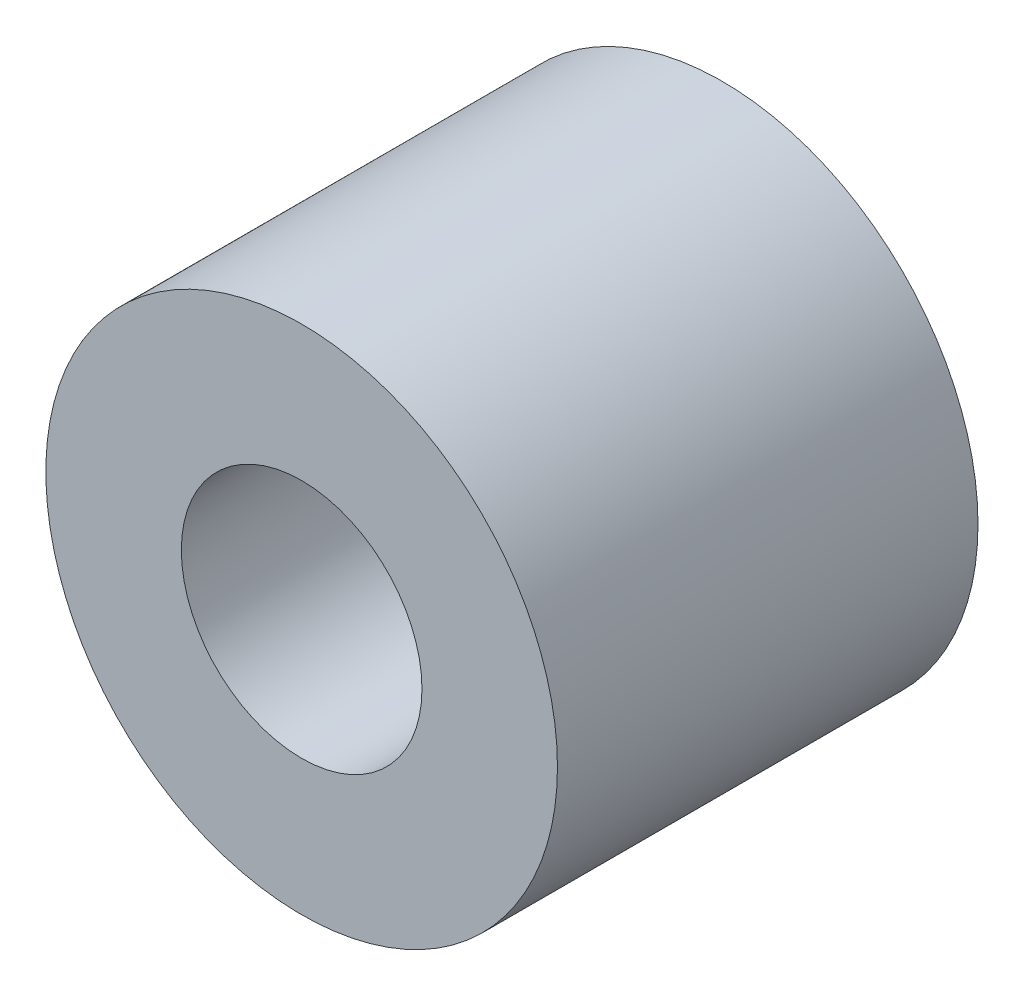
ISO-10303-21;
HEADER;
FILE_DESCRIPTION(('STEP AP214'),'2;1');
FILE_NAME('part.step','',(''),(''),'','','');
FILE_SCHEMA(('AUTOMOTIVE_DESIGN { 1 0 10303 214 1 1 1 1 }'));
ENDSEC;
DATA;
#1=APPLICATION_CONTEXT('core data for automotive mechanical design processes');
#2=APPLICATION_PROTOCOL_DEFINITION('international standard','automotive_design',2000,#1);
#3=PRODUCT_CONTEXT('',#1,'mechanical');
#4=PRODUCT('Part','Part','',(#3));
#5=PRODUCT_RELATED_PRODUCT_CATEGORY('part','',(#4));
#6=PRODUCT_DEFINITION_FORMATION('','',#4);
#7=PRODUCT_DEFINITION_CONTEXT('part definition',#1,'design');
#8=PRODUCT_DEFINITION('design','',#6,#7);
#9=PRODUCT_DEFINITION_SHAPE('','',#8);
#10=(LENGTH_UNIT() NAMED_UNIT(*) SI_UNIT(.MILLI.,.METRE.));
#11=(NAMED_UNIT(*) PLANE_ANGLE_UNIT() SI_UNIT($,.RADIAN.));
#12=(NAMED_UNIT(*) SI_UNIT($,.STERADIAN.) SOLID_ANGLE_UNIT());
#13=UNCERTAINTY_MEASURE_WITH_UNIT(LENGTH_MEASURE(1.E-05),#10,'distance_accuracy_value','');
#14=(GEOMETRIC_REPRESENTATION_CONTEXT(3) GLOBAL_UNCERTAINTY_ASSIGNED_CONTEXT((#13)) GLOBAL_UNIT_ASSIGNED_CONTEXT((#10,
#11,#12)) REPRESENTATION_CONTEXT('',''));
#15=CARTESIAN_POINT('',(0.,0.,0.));
#16=DIRECTION('',(0.,0.,1.));
#17=DIRECTION('',(1.,0.,0.));
#18=AXIS2_PLACEMENT_3D('',#15,#16,#17);
#19=CARTESIAN_POINT('',(0.,0.,18.));
#20=DIRECTION('',(0.,0.,1.));
#21=DIRECTION('',(1.,0.,0.));
#22=AXIS2_PLACEMENT_3D('',#19,#20,#21);
#23=PLANE('',#22);
#24=CARTESIAN_POINT('',(0.,0.,18.));
#25=DIRECTION('',(0.,0.,1.));
#26=DIRECTION('',(1.,0.,0.));
#27=AXIS2_PLACEMENT_3D('',#24,#25,#26);
#28=CIRCLE('',#27,10.95);
#29=CARTESIAN_POINT('',(10.95,0.,18.));
#30=VERTEX_POINT('',#29);
#31=EDGE_CURVE('E10',#30,#30,#28,.T.);
#32=ORIENTED_EDGE('',*,*,#31,.T.);
#33=EDGE_LOOP('',(#32));
#34=FACE_BOUND('',#33,.T.);
#35=CARTESIAN_POINT('',(0.,0.,18.));
#36=DIRECTION('',(0.,0.,1.));
#37=DIRECTION('',(1.,0.,0.));
#38=AXIS2_PLACEMENT_3D('',#35,#36,#37);
#39=CIRCLE('',#38,5.15);
#40=CARTESIAN_POINT('',(5.15,0.,18.));
#41=VERTEX_POINT('',#40);
#42=EDGE_CURVE('E42',#41,#41,#39,.T.);
#43=ORIENTED_EDGE('',*,*,#42,.F.);
#44=EDGE_LOOP('',(#43));
#45=FACE_BOUND('',#44,.T.);
#46=ADVANCED_FACE('F31',(#34,#45),#23,.T.);
#47=CARTESIAN_POINT('',(0.,0.,0.));
#48=DIRECTION('',(0.,0.,1.));
#49=DIRECTION('',(1.,0.,0.));
#50=AXIS2_PLACEMENT_3D('',#47,#48,#49);
#51=PLANE('',#50);
#52=CARTESIAN_POINT('',(0.,0.,0.));
#53=DIRECTION('',(0.,0.,1.));
#54=DIRECTION('',(1.,0.,0.));
#55=AXIS2_PLACEMENT_3D('',#52,#53,#54);
#56=CIRCLE('',#55,10.95);
#57=CARTESIAN_POINT('',(10.95,0.,0.));
#58=VERTEX_POINT('',#57);
#59=EDGE_CURVE('E35',#58,#58,#56,.T.);
#60=ORIENTED_EDGE('',*,*,#59,.F.);
#61=EDGE_LOOP('',(#60));
#62=FACE_BOUND('',#61,.T.);
#63=CARTESIAN_POINT('',(0.,0.,0.));
#64=DIRECTION('',(0.,0.,1.));
#65=DIRECTION('',(1.,0.,0.));
#66=AXIS2_PLACEMENT_3D('',#63,#64,#65);
#67=CIRCLE('',#66,5.15);
#68=CARTESIAN_POINT('',(5.15,0.,0.));
#69=VERTEX_POINT('',#68);
#70=EDGE_CURVE('E44',#69,#69,#67,.T.);
#71=ORIENTED_EDGE('',*,*,#70,.T.);
#72=EDGE_LOOP('',(#71));
#73=FACE_BOUND('',#72,.T.);
#74=ADVANCED_FACE('F54',(#62,#73),#51,.F.);
#75=CARTESIAN_POINT('',(0.,0.,18.));
#76=DIRECTION('',(0.,0.,-1.));
#77=DIRECTION('',(-1.,0.,0.));
#78=AXIS2_PLACEMENT_3D('',#75,#76,#77);
#79=CYLINDRICAL_SURFACE('',#78,10.95);
#80=ORIENTED_EDGE('',*,*,#31,.F.);
#81=EDGE_LOOP('',(#80));
#82=FACE_BOUND('',#81,.T.);
#83=ORIENTED_EDGE('',*,*,#59,.T.);
#84=EDGE_LOOP('',(#83));
#85=FACE_BOUND('',#84,.T.);
#86=ADVANCED_FACE('F33',(#82,#85),#79,.T.);
#87=CARTESIAN_POINT('',(0.,0.,18.));
#88=DIRECTION('',(0.,0.,-1.));
#89=DIRECTION('',(-1.,0.,0.));
#90=AXIS2_PLACEMENT_3D('',#87,#88,#89);
#91=CYLINDRICAL_SURFACE('',#90,5.15);
#92=ORIENTED_EDGE('',*,*,#42,.T.);
#93=EDGE_LOOP('',(#92));
#94=FACE_BOUND('',#93,.T.);
#95=ORIENTED_EDGE('',*,*,#70,.F.);
#96=EDGE_LOOP('',(#95));
#97=FACE_BOUND('',#96,.T.);
#98=ADVANCED_FACE('F50',(#94,#97),#91,.F.);
#99=CLOSED_SHELL('',(#46,#74,#86,#98));
#100=MANIFOLD_SOLID_BREP('B2',#99);
#101=ADVANCED_BREP_SHAPE_REPRESENTATION('',(#18,#100),#14);
#102=SHAPE_DEFINITION_REPRESENTATION(#9,#101);
ENDSEC;
END-ISO-10303-21;
